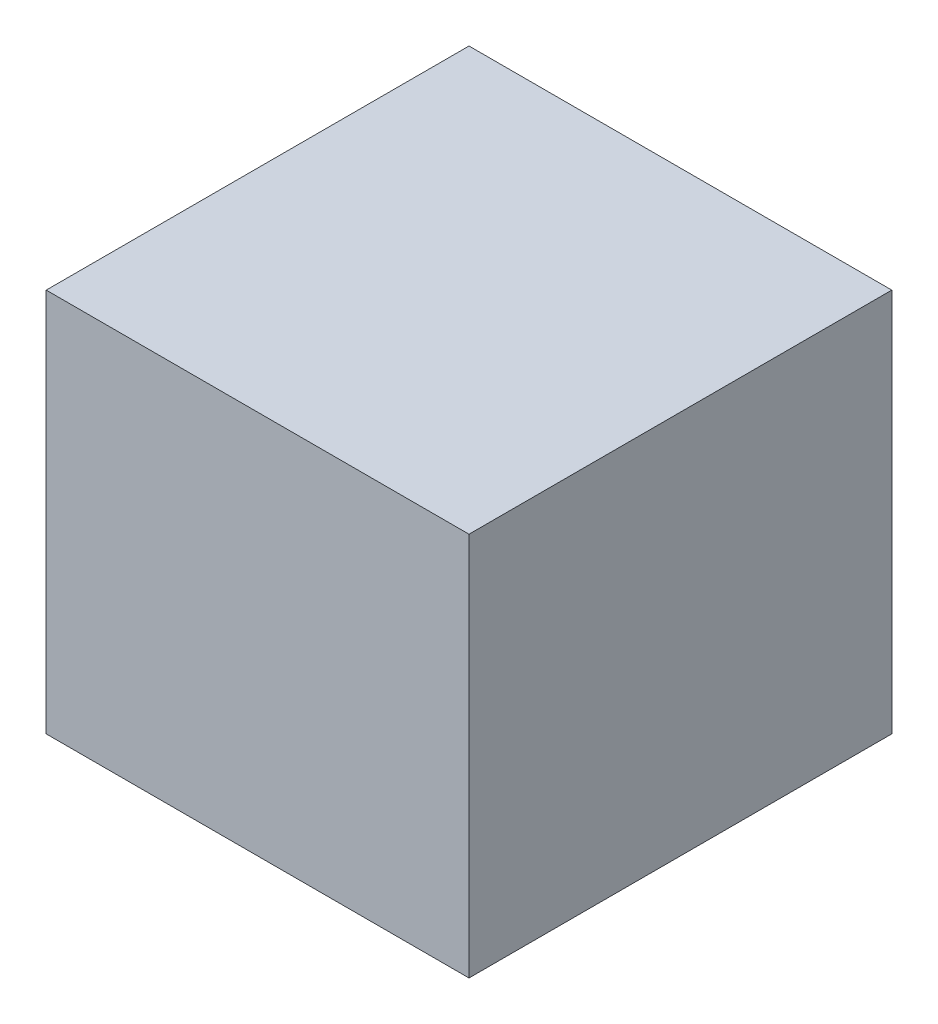
ISO-10303-21;
HEADER;
FILE_DESCRIPTION(('STEP AP214'),'2;1');
FILE_NAME('part.step','',(''),(''),'','','');
FILE_SCHEMA(('AUTOMOTIVE_DESIGN { 1 0 10303 214 1 1 1 1 }'));
ENDSEC;
DATA;
#1=APPLICATION_CONTEXT('core data for automotive mechanical design processes');
#2=APPLICATION_PROTOCOL_DEFINITION('international standard','automotive_design',2000,#1);
#3=PRODUCT_CONTEXT('',#1,'mechanical');
#4=PRODUCT('Part','Part','',(#3));
#5=PRODUCT_RELATED_PRODUCT_CATEGORY('part','',(#4));
#6=PRODUCT_DEFINITION_FORMATION('','',#4);
#7=PRODUCT_DEFINITION_CONTEXT('part definition',#1,'design');
#8=PRODUCT_DEFINITION('design','',#6,#7);
#9=PRODUCT_DEFINITION_SHAPE('','',#8);
#10=(LENGTH_UNIT() NAMED_UNIT(*) SI_UNIT(.MILLI.,.METRE.));
#11=(NAMED_UNIT(*) PLANE_ANGLE_UNIT() SI_UNIT($,.RADIAN.));
#12=(NAMED_UNIT(*) SI_UNIT($,.STERADIAN.) SOLID_ANGLE_UNIT());
#13=UNCERTAINTY_MEASURE_WITH_UNIT(LENGTH_MEASURE(1.E-05),#10,'distance_accuracy_value','');
#14=(GEOMETRIC_REPRESENTATION_CONTEXT(3) GLOBAL_UNCERTAINTY_ASSIGNED_CONTEXT((#13)) GLOBAL_UNIT_ASSIGNED_CONTEXT((#10,
#11,#12)) REPRESENTATION_CONTEXT('',''));
#15=CARTESIAN_POINT('',(0.,0.,0.));
#16=DIRECTION('',(0.,0.,1.));
#17=DIRECTION('',(1.,0.,0.));
#18=AXIS2_PLACEMENT_3D('',#15,#16,#17);
#19=CARTESIAN_POINT('',(-139.7,254.,139.7));
#20=DIRECTION('',(1.,0.,0.));
#21=DIRECTION('',(0.,0.,-1.));
#22=AXIS2_PLACEMENT_3D('',#19,#20,#21);
#23=PLANE('',#22);
#24=DIRECTION('',(0.,0.,1.));
#25=VECTOR('',#24,1.);
#26=CARTESIAN_POINT('',(-139.7,0.,139.7));
#27=LINE('',#26,#25);
#28=CARTESIAN_POINT('',(-139.7,0.,-139.7));
#29=VERTEX_POINT('',#28);
#30=CARTESIAN_POINT('',(-139.7,0.,139.7));
#31=VERTEX_POINT('',#30);
#32=EDGE_CURVE('E96',#29,#31,#27,.T.);
#33=ORIENTED_EDGE('',*,*,#32,.T.);
#34=DIRECTION('',(0.,-1.,0.));
#35=VECTOR('',#34,1.);
#36=CARTESIAN_POINT('',(-139.7,254.,139.7));
#37=LINE('',#36,#35);
#38=CARTESIAN_POINT('',(-139.7,254.,139.7));
#39=VERTEX_POINT('',#38);
#40=EDGE_CURVE('E11',#39,#31,#37,.T.);
#41=ORIENTED_EDGE('',*,*,#40,.F.);
#42=DIRECTION('',(0.,0.,1.));
#43=VECTOR('',#42,1.);
#44=CARTESIAN_POINT('',(-139.7,254.,139.7));
#45=LINE('',#44,#43);
#46=CARTESIAN_POINT('',(-139.7,254.,-139.7));
#47=VERTEX_POINT('',#46);
#48=EDGE_CURVE('E84',#47,#39,#45,.T.);
#49=ORIENTED_EDGE('',*,*,#48,.F.);
#50=DIRECTION('',(0.,-1.,0.));
#51=VECTOR('',#50,1.);
#52=CARTESIAN_POINT('',(-139.7,254.,-139.7));
#53=LINE('',#52,#51);
#54=EDGE_CURVE('E92',#47,#29,#53,.T.);
#55=ORIENTED_EDGE('',*,*,#54,.T.);
#56=EDGE_LOOP('',(#33,#41,#49,#55));
#57=FACE_BOUND('',#56,.T.);
#58=ADVANCED_FACE('F33',(#57),#23,.F.);
#59=CARTESIAN_POINT('',(139.7,254.,139.7));
#60=DIRECTION('',(0.,0.,-1.));
#61=DIRECTION('',(-1.,0.,0.));
#62=AXIS2_PLACEMENT_3D('',#59,#60,#61);
#63=PLANE('',#62);
#64=DIRECTION('',(1.,0.,0.));
#65=VECTOR('',#64,1.);
#66=CARTESIAN_POINT('',(139.7,0.,139.7));
#67=LINE('',#66,#65);
#68=CARTESIAN_POINT('',(139.7,0.,139.7));
#69=VERTEX_POINT('',#68);
#70=EDGE_CURVE('E88',#31,#69,#67,.T.);
#71=ORIENTED_EDGE('',*,*,#70,.T.);
#72=DIRECTION('',(0.,-1.,0.));
#73=VECTOR('',#72,1.);
#74=CARTESIAN_POINT('',(139.7,254.,139.7));
#75=LINE('',#74,#73);
#76=CARTESIAN_POINT('',(139.7,254.,139.7));
#77=VERTEX_POINT('',#76);
#78=EDGE_CURVE('E41',#77,#69,#75,.T.);
#79=ORIENTED_EDGE('',*,*,#78,.F.);
#80=DIRECTION('',(1.,0.,0.));
#81=VECTOR('',#80,1.);
#82=CARTESIAN_POINT('',(139.7,254.,139.7));
#83=LINE('',#82,#81);
#84=EDGE_CURVE('E79',#39,#77,#83,.T.);
#85=ORIENTED_EDGE('',*,*,#84,.F.);
#86=ORIENTED_EDGE('',*,*,#40,.T.);
#87=EDGE_LOOP('',(#71,#79,#85,#86));
#88=FACE_BOUND('',#87,.T.);
#89=ADVANCED_FACE('F87',(#88),#63,.F.);
#90=CARTESIAN_POINT('',(139.7,254.,139.7));
#91=DIRECTION('',(-1.,0.,0.));
#92=DIRECTION('',(0.,0.,1.));
#93=AXIS2_PLACEMENT_3D('',#90,#91,#92);
#94=PLANE('',#93);
#95=DIRECTION('',(0.,0.,-1.));
#96=VECTOR('',#95,1.);
#97=CARTESIAN_POINT('',(139.7,0.,139.7));
#98=LINE('',#97,#96);
#99=CARTESIAN_POINT('',(139.7,0.,-139.7));
#100=VERTEX_POINT('',#99);
#101=EDGE_CURVE('E66',#69,#100,#98,.T.);
#102=ORIENTED_EDGE('',*,*,#101,.T.);
#103=DIRECTION('',(0.,-1.,0.));
#104=VECTOR('',#103,1.);
#105=CARTESIAN_POINT('',(139.7,254.,-139.7));
#106=LINE('',#105,#104);
#107=CARTESIAN_POINT('',(139.7,254.,-139.7));
#108=VERTEX_POINT('',#107);
#109=EDGE_CURVE('E89',#108,#100,#106,.T.);
#110=ORIENTED_EDGE('',*,*,#109,.F.);
#111=DIRECTION('',(0.,0.,-1.));
#112=VECTOR('',#111,1.);
#113=CARTESIAN_POINT('',(139.7,254.,139.7));
#114=LINE('',#113,#112);
#115=EDGE_CURVE('E82',#77,#108,#114,.T.);
#116=ORIENTED_EDGE('',*,*,#115,.F.);
#117=ORIENTED_EDGE('',*,*,#78,.T.);
#118=EDGE_LOOP('',(#102,#110,#116,#117));
#119=FACE_BOUND('',#118,.T.);
#120=ADVANCED_FACE('F90',(#119),#94,.F.);
#121=CARTESIAN_POINT('',(139.7,254.,-139.7));
#122=DIRECTION('',(0.,0.,1.));
#123=DIRECTION('',(1.,0.,0.));
#124=AXIS2_PLACEMENT_3D('',#121,#122,#123);
#125=PLANE('',#124);
#126=DIRECTION('',(-1.,0.,0.));
#127=VECTOR('',#126,1.);
#128=CARTESIAN_POINT('',(139.7,0.,-139.7));
#129=LINE('',#128,#127);
#130=EDGE_CURVE('E72',#100,#29,#129,.T.);
#131=ORIENTED_EDGE('',*,*,#130,.T.);
#132=ORIENTED_EDGE('',*,*,#54,.F.);
#133=DIRECTION('',(-1.,0.,0.));
#134=VECTOR('',#133,1.);
#135=CARTESIAN_POINT('',(139.7,254.,-139.7));
#136=LINE('',#135,#134);
#137=EDGE_CURVE('E49',#108,#47,#136,.T.);
#138=ORIENTED_EDGE('',*,*,#137,.F.);
#139=ORIENTED_EDGE('',*,*,#109,.T.);
#140=EDGE_LOOP('',(#131,#132,#138,#139));
#141=FACE_BOUND('',#140,.T.);
#142=ADVANCED_FACE('F103',(#141),#125,.F.);
#143=CARTESIAN_POINT('',(0.,254.,0.));
#144=DIRECTION('',(0.,1.,0.));
#145=DIRECTION('',(0.,0.,1.));
#146=AXIS2_PLACEMENT_3D('',#143,#144,#145);
#147=PLANE('',#146);
#148=ORIENTED_EDGE('',*,*,#48,.T.);
#149=ORIENTED_EDGE('',*,*,#84,.T.);
#150=ORIENTED_EDGE('',*,*,#115,.T.);
#151=ORIENTED_EDGE('',*,*,#137,.T.);
#152=EDGE_LOOP('',(#148,#149,#150,#151));
#153=FACE_BOUND('',#152,.T.);
#154=ADVANCED_FACE('F80',(#153),#147,.T.);
#155=CARTESIAN_POINT('',(0.,0.,0.));
#156=DIRECTION('',(0.,1.,0.));
#157=DIRECTION('',(0.,0.,1.));
#158=AXIS2_PLACEMENT_3D('',#155,#156,#157);
#159=PLANE('',#158);
#160=ORIENTED_EDGE('',*,*,#32,.F.);
#161=ORIENTED_EDGE('',*,*,#130,.F.);
#162=ORIENTED_EDGE('',*,*,#101,.F.);
#163=ORIENTED_EDGE('',*,*,#70,.F.);
#164=EDGE_LOOP('',(#160,#161,#162,#163));
#165=FACE_BOUND('',#164,.T.);
#166=ADVANCED_FACE('F106',(#165),#159,.F.);
#167=CLOSED_SHELL('',(#58,#89,#120,#142,#154,#166));
#168=MANIFOLD_SOLID_BREP('B2',#167);
#169=ADVANCED_BREP_SHAPE_REPRESENTATION('',(#18,#168),#14);
#170=SHAPE_DEFINITION_REPRESENTATION(#9,#169);
ENDSEC;
END-ISO-10303-21;
